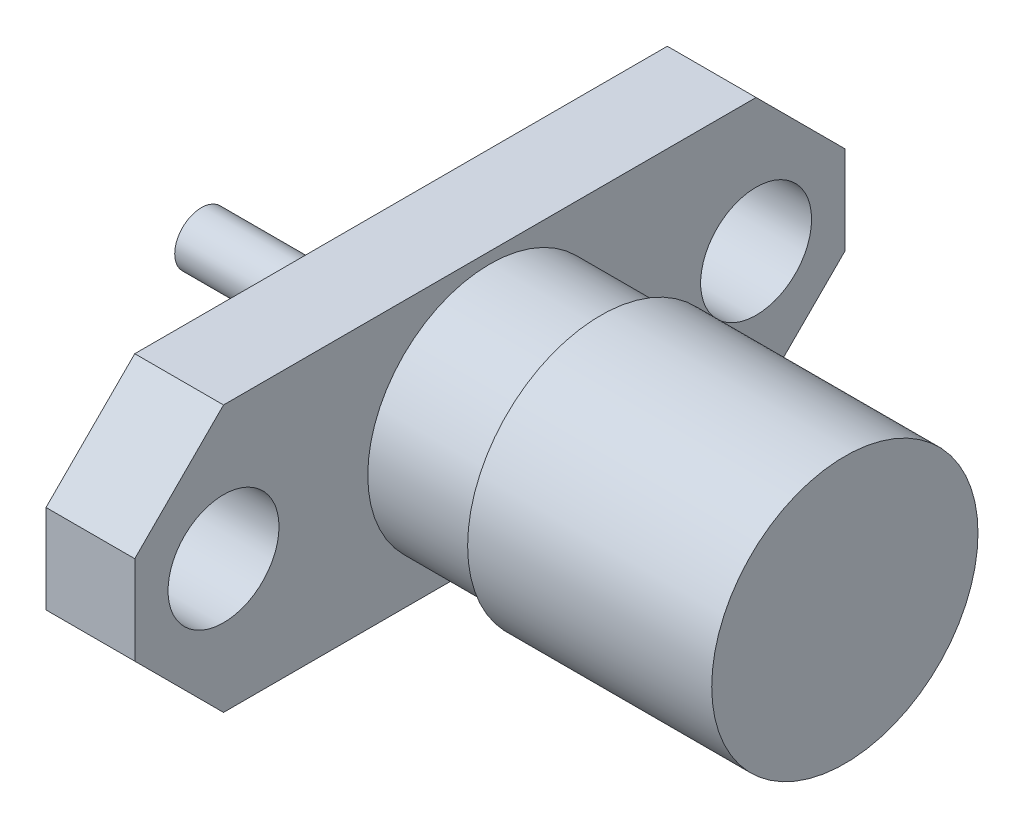
ISO-10303-21;
HEADER;
FILE_DESCRIPTION(('STEP AP214'),'2;1');
FILE_NAME('part.step','',(''),(''),'','','');
FILE_SCHEMA(('AUTOMOTIVE_DESIGN { 1 0 10303 214 1 1 1 1 }'));
ENDSEC;
DATA;
#1=APPLICATION_CONTEXT('core data for automotive mechanical design processes');
#2=APPLICATION_PROTOCOL_DEFINITION('international standard','automotive_design',2000,#1);
#3=PRODUCT_CONTEXT('',#1,'mechanical');
#4=PRODUCT('Part','Part','',(#3));
#5=PRODUCT_RELATED_PRODUCT_CATEGORY('part','',(#4));
#6=PRODUCT_DEFINITION_FORMATION('','',#4);
#7=PRODUCT_DEFINITION_CONTEXT('part definition',#1,'design');
#8=PRODUCT_DEFINITION('design','',#6,#7);
#9=PRODUCT_DEFINITION_SHAPE('','',#8);
#10=(LENGTH_UNIT() NAMED_UNIT(*) SI_UNIT(.MILLI.,.METRE.));
#11=(NAMED_UNIT(*) PLANE_ANGLE_UNIT() SI_UNIT($,.RADIAN.));
#12=(NAMED_UNIT(*) SI_UNIT($,.STERADIAN.) SOLID_ANGLE_UNIT());
#13=UNCERTAINTY_MEASURE_WITH_UNIT(LENGTH_MEASURE(1.E-05),#10,'distance_accuracy_value','');
#14=(GEOMETRIC_REPRESENTATION_CONTEXT(3) GLOBAL_UNCERTAINTY_ASSIGNED_CONTEXT((#13)) GLOBAL_UNIT_ASSIGNED_CONTEXT((#10,
#11,#12)) REPRESENTATION_CONTEXT('',''));
#15=CARTESIAN_POINT('',(0.,0.,0.));
#16=DIRECTION('',(0.,0.,1.));
#17=DIRECTION('',(1.,0.,0.));
#18=AXIS2_PLACEMENT_3D('',#15,#16,#17);
#19=CARTESIAN_POINT('',(2.,0.,8.));
#20=DIRECTION('',(0.,0.,1.));
#21=DIRECTION('',(1.,0.,0.));
#22=AXIS2_PLACEMENT_3D('',#19,#20,#21);
#23=PLANE('',#22);
#24=DIRECTION('',(0.,1.,0.));
#25=VECTOR('',#24,1.);
#26=CARTESIAN_POINT('',(0.,0.,8.));
#27=LINE('',#26,#25);
#28=CARTESIAN_POINT('',(0.,-0.999999999999881,8.));
#29=VERTEX_POINT('',#28);
#30=CARTESIAN_POINT('',(0.,0.999999999999882,8.));
#31=VERTEX_POINT('',#30);
#32=EDGE_CURVE('E155',#29,#31,#27,.T.);
#33=ORIENTED_EDGE('',*,*,#32,.F.);
#34=DIRECTION('',(-1.,0.,0.));
#35=VECTOR('',#34,1.);
#36=CARTESIAN_POINT('',(2.,-0.999999999999881,8.));
#37=LINE('',#36,#35);
#38=CARTESIAN_POINT('',(2.,-0.999999999999881,8.));
#39=VERTEX_POINT('',#38);
#40=EDGE_CURVE('E11',#39,#29,#37,.T.);
#41=ORIENTED_EDGE('',*,*,#40,.F.);
#42=DIRECTION('',(0.,1.,0.));
#43=VECTOR('',#42,1.);
#44=CARTESIAN_POINT('',(2.,0.,8.));
#45=LINE('',#44,#43);
#46=CARTESIAN_POINT('',(2.,0.999999999999882,8.));
#47=VERTEX_POINT('',#46);
#48=EDGE_CURVE('E171',#39,#47,#45,.T.);
#49=ORIENTED_EDGE('',*,*,#48,.T.);
#50=DIRECTION('',(-1.,0.,0.));
#51=VECTOR('',#50,1.);
#52=CARTESIAN_POINT('',(2.,0.999999999999882,8.));
#53=LINE('',#52,#51);
#54=EDGE_CURVE('E49',#47,#31,#53,.T.);
#55=ORIENTED_EDGE('',*,*,#54,.T.);
#56=EDGE_LOOP('',(#33,#41,#49,#55));
#57=FACE_BOUND('',#56,.T.);
#58=ADVANCED_FACE('F33',(#57),#23,.T.);
#59=CARTESIAN_POINT('',(2.,-4.49999999999991,4.50000000000018));
#60=DIRECTION('',(0.,0.707106781186526,-0.707106781186569));
#61=DIRECTION('',(0.,0.707106781186569,0.707106781186526));
#62=AXIS2_PLACEMENT_3D('',#59,#60,#61);
#63=PLANE('',#62);
#64=DIRECTION('',(0.,-0.707106781186569,-0.707106781186526));
#65=VECTOR('',#64,1.);
#66=CARTESIAN_POINT('',(0.,-4.49999999999991,4.50000000000018));
#67=LINE('',#66,#65);
#68=CARTESIAN_POINT('',(0.,-3.,6.));
#69=VERTEX_POINT('',#68);
#70=EDGE_CURVE('E148',#29,#69,#67,.T.);
#71=ORIENTED_EDGE('',*,*,#70,.T.);
#72=DIRECTION('',(-1.,0.,0.));
#73=VECTOR('',#72,1.);
#74=CARTESIAN_POINT('',(2.,-3.,6.));
#75=LINE('',#74,#73);
#76=CARTESIAN_POINT('',(2.,-3.,6.));
#77=VERTEX_POINT('',#76);
#78=EDGE_CURVE('E41',#77,#69,#75,.T.);
#79=ORIENTED_EDGE('',*,*,#78,.F.);
#80=DIRECTION('',(0.,-0.707106781186569,-0.707106781186526));
#81=VECTOR('',#80,1.);
#82=CARTESIAN_POINT('',(2.,-4.49999999999991,4.50000000000018));
#83=LINE('',#82,#81);
#84=EDGE_CURVE('E194',#39,#77,#83,.T.);
#85=ORIENTED_EDGE('',*,*,#84,.F.);
#86=ORIENTED_EDGE('',*,*,#40,.T.);
#87=EDGE_LOOP('',(#71,#79,#85,#86));
#88=FACE_BOUND('',#87,.T.);
#89=ADVANCED_FACE('F203',(#88),#63,.F.);
#90=CARTESIAN_POINT('',(2.,-3.,0.));
#91=DIRECTION('',(0.,1.,0.));
#92=DIRECTION('',(0.,0.,1.));
#93=AXIS2_PLACEMENT_3D('',#90,#91,#92);
#94=PLANE('',#93);
#95=DIRECTION('',(0.,0.,-1.));
#96=VECTOR('',#95,1.);
#97=CARTESIAN_POINT('',(0.,-3.,0.));
#98=LINE('',#97,#96);
#99=CARTESIAN_POINT('',(0.,-3.,-6.00000000000004));
#100=VERTEX_POINT('',#99);
#101=EDGE_CURVE('E140',#69,#100,#98,.T.);
#102=ORIENTED_EDGE('',*,*,#101,.T.);
#103=DIRECTION('',(-1.,0.,0.));
#104=VECTOR('',#103,1.);
#105=CARTESIAN_POINT('',(2.,-3.,-6.00000000000004));
#106=LINE('',#105,#104);
#107=CARTESIAN_POINT('',(2.,-3.,-6.00000000000004));
#108=VERTEX_POINT('',#107);
#109=EDGE_CURVE('E131',#108,#100,#106,.T.);
#110=ORIENTED_EDGE('',*,*,#109,.F.);
#111=DIRECTION('',(0.,0.,-1.));
#112=VECTOR('',#111,1.);
#113=CARTESIAN_POINT('',(2.,-3.,0.));
#114=LINE('',#113,#112);
#115=EDGE_CURVE('E142',#77,#108,#114,.T.);
#116=ORIENTED_EDGE('',*,*,#115,.F.);
#117=ORIENTED_EDGE('',*,*,#78,.T.);
#118=EDGE_LOOP('',(#102,#110,#116,#117));
#119=FACE_BOUND('',#118,.T.);
#120=ADVANCED_FACE('F138',(#119),#94,.F.);
#121=CARTESIAN_POINT('',(2.,-4.49999999999994,-4.50000000000018));
#122=DIRECTION('',(0.,-0.707106781186529,-0.707106781186567));
#123=DIRECTION('',(0.,0.707106781186567,-0.707106781186529));
#124=AXIS2_PLACEMENT_3D('',#121,#122,#123);
#125=PLANE('',#124);
#126=DIRECTION('',(0.,-0.707106781186567,0.707106781186528));
#127=VECTOR('',#126,1.);
#128=CARTESIAN_POINT('',(0.,-4.49999999999994,-4.50000000000018));
#129=LINE('',#128,#127);
#130=CARTESIAN_POINT('',(0.,-0.999999999999931,-8.));
#131=VERTEX_POINT('',#130);
#132=EDGE_CURVE('E151',#131,#100,#129,.T.);
#133=ORIENTED_EDGE('',*,*,#132,.F.);
#134=DIRECTION('',(-1.,0.,0.));
#135=VECTOR('',#134,1.);
#136=CARTESIAN_POINT('',(2.,-0.999999999999931,-8.));
#137=LINE('',#136,#135);
#138=CARTESIAN_POINT('',(2.,-0.999999999999931,-8.));
#139=VERTEX_POINT('',#138);
#140=EDGE_CURVE('E125',#139,#131,#137,.T.);
#141=ORIENTED_EDGE('',*,*,#140,.F.);
#142=DIRECTION('',(0.,-0.707106781186567,0.707106781186528));
#143=VECTOR('',#142,1.);
#144=CARTESIAN_POINT('',(2.,-4.49999999999994,-4.50000000000018));
#145=LINE('',#144,#143);
#146=EDGE_CURVE('E197',#139,#108,#145,.T.);
#147=ORIENTED_EDGE('',*,*,#146,.T.);
#148=ORIENTED_EDGE('',*,*,#109,.T.);
#149=EDGE_LOOP('',(#133,#141,#147,#148));
#150=FACE_BOUND('',#149,.T.);
#151=ADVANCED_FACE('F210',(#150),#125,.T.);
#152=CARTESIAN_POINT('',(2.,0.,-8.));
#153=DIRECTION('',(0.,0.,1.));
#154=DIRECTION('',(1.,0.,0.));
#155=AXIS2_PLACEMENT_3D('',#152,#153,#154);
#156=PLANE('',#155);
#157=DIRECTION('',(0.,1.,0.));
#158=VECTOR('',#157,1.);
#159=CARTESIAN_POINT('',(0.,0.,-8.));
#160=LINE('',#159,#158);
#161=CARTESIAN_POINT('',(0.,0.999999999999931,-8.));
#162=VERTEX_POINT('',#161);
#163=EDGE_CURVE('E153',#131,#162,#160,.T.);
#164=ORIENTED_EDGE('',*,*,#163,.T.);
#165=DIRECTION('',(-1.,0.,0.));
#166=VECTOR('',#165,1.);
#167=CARTESIAN_POINT('',(2.,0.999999999999931,-8.));
#168=LINE('',#167,#166);
#169=CARTESIAN_POINT('',(2.,0.999999999999931,-8.));
#170=VERTEX_POINT('',#169);
#171=EDGE_CURVE('E123',#170,#162,#168,.T.);
#172=ORIENTED_EDGE('',*,*,#171,.F.);
#173=DIRECTION('',(0.,1.,0.));
#174=VECTOR('',#173,1.);
#175=CARTESIAN_POINT('',(2.,0.,-8.));
#176=LINE('',#175,#174);
#177=EDGE_CURVE('E114',#139,#170,#176,.T.);
#178=ORIENTED_EDGE('',*,*,#177,.F.);
#179=ORIENTED_EDGE('',*,*,#140,.T.);
#180=EDGE_LOOP('',(#164,#172,#178,#179));
#181=FACE_BOUND('',#180,.T.);
#182=ADVANCED_FACE('F215',(#181),#156,.F.);
#183=CARTESIAN_POINT('',(2.,4.49999999999994,-4.50000000000018));
#184=DIRECTION('',(0.,-0.707106781186529,0.707106781186567));
#185=DIRECTION('',(0.,-0.707106781186567,-0.707106781186529));
#186=AXIS2_PLACEMENT_3D('',#183,#184,#185);
#187=PLANE('',#186);
#188=DIRECTION('',(0.,0.707106781186567,0.707106781186528));
#189=VECTOR('',#188,1.);
#190=CARTESIAN_POINT('',(0.,4.49999999999994,-4.50000000000018));
#191=LINE('',#190,#189);
#192=CARTESIAN_POINT('',(0.,3.,-6.00000000000004));
#193=VERTEX_POINT('',#192);
#194=EDGE_CURVE('E121',#162,#193,#191,.T.);
#195=ORIENTED_EDGE('',*,*,#194,.T.);
#196=DIRECTION('',(-1.,0.,0.));
#197=VECTOR('',#196,1.);
#198=CARTESIAN_POINT('',(2.,3.,-6.00000000000004));
#199=LINE('',#198,#197);
#200=CARTESIAN_POINT('',(2.,3.,-6.00000000000004));
#201=VERTEX_POINT('',#200);
#202=EDGE_CURVE('E102',#201,#193,#199,.T.);
#203=ORIENTED_EDGE('',*,*,#202,.F.);
#204=DIRECTION('',(0.,0.707106781186567,0.707106781186528));
#205=VECTOR('',#204,1.);
#206=CARTESIAN_POINT('',(2.,4.49999999999994,-4.50000000000018));
#207=LINE('',#206,#205);
#208=EDGE_CURVE('E107',#170,#201,#207,.T.);
#209=ORIENTED_EDGE('',*,*,#208,.F.);
#210=ORIENTED_EDGE('',*,*,#171,.T.);
#211=EDGE_LOOP('',(#195,#203,#209,#210));
#212=FACE_BOUND('',#211,.T.);
#213=ADVANCED_FACE('F119',(#212),#187,.F.);
#214=CARTESIAN_POINT('',(2.,3.,0.));
#215=DIRECTION('',(0.,1.,0.));
#216=DIRECTION('',(0.,0.,1.));
#217=AXIS2_PLACEMENT_3D('',#214,#215,#216);
#218=PLANE('',#217);
#219=DIRECTION('',(0.,0.,-1.));
#220=VECTOR('',#219,1.);
#221=CARTESIAN_POINT('',(0.,3.,0.));
#222=LINE('',#221,#220);
#223=CARTESIAN_POINT('',(0.,3.,6.));
#224=VERTEX_POINT('',#223);
#225=EDGE_CURVE('E161',#224,#193,#222,.T.);
#226=ORIENTED_EDGE('',*,*,#225,.F.);
#227=DIRECTION('',(-1.,0.,0.));
#228=VECTOR('',#227,1.);
#229=CARTESIAN_POINT('',(2.,3.,6.));
#230=LINE('',#229,#228);
#231=CARTESIAN_POINT('',(2.,3.,6.));
#232=VERTEX_POINT('',#231);
#233=EDGE_CURVE('E74',#232,#224,#230,.T.);
#234=ORIENTED_EDGE('',*,*,#233,.F.);
#235=DIRECTION('',(0.,0.,-1.));
#236=VECTOR('',#235,1.);
#237=CARTESIAN_POINT('',(2.,3.,0.));
#238=LINE('',#237,#236);
#239=EDGE_CURVE('E98',#232,#201,#238,.T.);
#240=ORIENTED_EDGE('',*,*,#239,.T.);
#241=ORIENTED_EDGE('',*,*,#202,.T.);
#242=EDGE_LOOP('',(#226,#234,#240,#241));
#243=FACE_BOUND('',#242,.T.);
#244=ADVANCED_FACE('F100',(#243),#218,.T.);
#245=CARTESIAN_POINT('',(2.,0.,6.00000000000001));
#246=DIRECTION('',(-1.,0.,0.));
#247=DIRECTION('',(0.,0.,1.));
#248=AXIS2_PLACEMENT_3D('',#245,#246,#247);
#249=CYLINDRICAL_SURFACE('',#248,1.25);
#250=CARTESIAN_POINT('',(2.,0.,6.00000000000001));
#251=DIRECTION('',(1.,0.,0.));
#252=DIRECTION('',(0.,0.,-1.));
#253=AXIS2_PLACEMENT_3D('',#250,#251,#252);
#254=CIRCLE('',#253,1.25);
#255=CARTESIAN_POINT('',(2.,0.,4.75000000000001));
#256=VERTEX_POINT('',#255);
#257=EDGE_CURVE('E174',#256,#256,#254,.T.);
#258=ORIENTED_EDGE('',*,*,#257,.T.);
#259=EDGE_LOOP('',(#258));
#260=FACE_BOUND('',#259,.T.);
#261=CARTESIAN_POINT('',(0.,0.,6.00000000000001));
#262=DIRECTION('',(1.,0.,0.));
#263=DIRECTION('',(0.,0.,-1.));
#264=AXIS2_PLACEMENT_3D('',#261,#262,#263);
#265=CIRCLE('',#264,1.25);
#266=CARTESIAN_POINT('',(0.,0.,4.75000000000001));
#267=VERTEX_POINT('',#266);
#268=EDGE_CURVE('E166',#267,#267,#265,.T.);
#269=ORIENTED_EDGE('',*,*,#268,.F.);
#270=EDGE_LOOP('',(#269));
#271=FACE_BOUND('',#270,.T.);
#272=ADVANCED_FACE('F224',(#260,#271),#249,.F.);
#273=CARTESIAN_POINT('',(2.,4.49999999999991,4.50000000000018));
#274=DIRECTION('',(0.,0.707106781186526,0.707106781186569));
#275=DIRECTION('',(0.,-0.707106781186569,0.707106781186526));
#276=AXIS2_PLACEMENT_3D('',#273,#274,#275);
#277=PLANE('',#276);
#278=DIRECTION('',(0.,0.707106781186569,-0.707106781186526));
#279=VECTOR('',#278,1.);
#280=CARTESIAN_POINT('',(0.,4.49999999999991,4.50000000000018));
#281=LINE('',#280,#279);
#282=EDGE_CURVE('E163',#31,#224,#281,.T.);
#283=ORIENTED_EDGE('',*,*,#282,.F.);
#284=ORIENTED_EDGE('',*,*,#54,.F.);
#285=DIRECTION('',(0.,0.707106781186569,-0.707106781186526));
#286=VECTOR('',#285,1.);
#287=CARTESIAN_POINT('',(2.,4.49999999999991,4.50000000000018));
#288=LINE('',#287,#286);
#289=EDGE_CURVE('E106',#47,#232,#288,.T.);
#290=ORIENTED_EDGE('',*,*,#289,.T.);
#291=ORIENTED_EDGE('',*,*,#233,.T.);
#292=EDGE_LOOP('',(#283,#284,#290,#291));
#293=FACE_BOUND('',#292,.T.);
#294=ADVANCED_FACE('F200',(#293),#277,.T.);
#295=CARTESIAN_POINT('',(2.,0.,-6.00000000000001));
#296=DIRECTION('',(-1.,0.,0.));
#297=DIRECTION('',(0.,0.,1.));
#298=AXIS2_PLACEMENT_3D('',#295,#296,#297);
#299=CYLINDRICAL_SURFACE('',#298,1.25);
#300=CARTESIAN_POINT('',(2.,0.,-6.00000000000001));
#301=DIRECTION('',(1.,0.,0.));
#302=DIRECTION('',(0.,0.,-1.));
#303=AXIS2_PLACEMENT_3D('',#300,#301,#302);
#304=CIRCLE('',#303,1.25);
#305=CARTESIAN_POINT('',(2.,0.,-7.25000000000001));
#306=VERTEX_POINT('',#305);
#307=EDGE_CURVE('E172',#306,#306,#304,.F.);
#308=ORIENTED_EDGE('',*,*,#307,.F.);
#309=EDGE_LOOP('',(#308));
#310=FACE_BOUND('',#309,.T.);
#311=CARTESIAN_POINT('',(0.,0.,-6.00000000000001));
#312=DIRECTION('',(1.,0.,0.));
#313=DIRECTION('',(0.,0.,-1.));
#314=AXIS2_PLACEMENT_3D('',#311,#312,#313);
#315=CIRCLE('',#314,1.25);
#316=CARTESIAN_POINT('',(0.,0.,-7.25000000000001));
#317=VERTEX_POINT('',#316);
#318=EDGE_CURVE('E169',#317,#317,#315,.F.);
#319=ORIENTED_EDGE('',*,*,#318,.T.);
#320=EDGE_LOOP('',(#319));
#321=FACE_BOUND('',#320,.T.);
#322=ADVANCED_FACE('F227',(#310,#321),#299,.F.);
#323=CARTESIAN_POINT('',(2.,0.,0.));
#324=DIRECTION('',(1.,0.,0.));
#325=DIRECTION('',(0.,0.,-1.));
#326=AXIS2_PLACEMENT_3D('',#323,#324,#325);
#327=PLANE('',#326);
#328=ORIENTED_EDGE('',*,*,#208,.T.);
#329=ORIENTED_EDGE('',*,*,#239,.F.);
#330=ORIENTED_EDGE('',*,*,#289,.F.);
#331=ORIENTED_EDGE('',*,*,#48,.F.);
#332=ORIENTED_EDGE('',*,*,#84,.T.);
#333=ORIENTED_EDGE('',*,*,#115,.T.);
#334=ORIENTED_EDGE('',*,*,#146,.F.);
#335=ORIENTED_EDGE('',*,*,#177,.T.);
#336=EDGE_LOOP('',(#328,#329,#330,#331,#332,#333,#334,#335));
#337=FACE_BOUND('',#336,.T.);
#338=ORIENTED_EDGE('',*,*,#307,.T.);
#339=EDGE_LOOP('',(#338));
#340=FACE_BOUND('',#339,.T.);
#341=CARTESIAN_POINT('',(2.,0.,0.));
#342=DIRECTION('',(-1.,0.,0.));
#343=DIRECTION('',(0.,0.,1.));
#344=AXIS2_PLACEMENT_3D('',#341,#342,#343);
#345=CIRCLE('',#344,2.75);
#346=CARTESIAN_POINT('',(2.,0.,2.75));
#347=VERTEX_POINT('',#346);
#348=EDGE_CURVE('E278',#347,#347,#345,.T.);
#349=ORIENTED_EDGE('',*,*,#348,.T.);
#350=EDGE_LOOP('',(#349));
#351=FACE_BOUND('',#350,.T.);
#352=ORIENTED_EDGE('',*,*,#257,.F.);
#353=EDGE_LOOP('',(#352));
#354=FACE_BOUND('',#353,.T.);
#355=ADVANCED_FACE('F110',(#337,#340,#351,#354),#327,.T.);
#356=CARTESIAN_POINT('',(0.,0.,0.));
#357=DIRECTION('',(1.,0.,0.));
#358=DIRECTION('',(0.,0.,-1.));
#359=AXIS2_PLACEMENT_3D('',#356,#357,#358);
#360=PLANE('',#359);
#361=CARTESIAN_POINT('',(0.,0.,0.));
#362=DIRECTION('',(-1.,0.,0.));
#363=DIRECTION('',(0.,0.,1.));
#364=AXIS2_PLACEMENT_3D('',#361,#362,#363);
#365=CIRCLE('',#364,2.25);
#366=CARTESIAN_POINT('',(0.,0.,2.25));
#367=VERTEX_POINT('',#366);
#368=EDGE_CURVE('E182',#367,#367,#365,.T.);
#369=ORIENTED_EDGE('',*,*,#368,.F.);
#370=EDGE_LOOP('',(#369));
#371=FACE_BOUND('',#370,.T.);
#372=ORIENTED_EDGE('',*,*,#32,.T.);
#373=ORIENTED_EDGE('',*,*,#282,.T.);
#374=ORIENTED_EDGE('',*,*,#225,.T.);
#375=ORIENTED_EDGE('',*,*,#194,.F.);
#376=ORIENTED_EDGE('',*,*,#163,.F.);
#377=ORIENTED_EDGE('',*,*,#132,.T.);
#378=ORIENTED_EDGE('',*,*,#101,.F.);
#379=ORIENTED_EDGE('',*,*,#70,.F.);
#380=EDGE_LOOP('',(#372,#373,#374,#375,#376,#377,#378,#379));
#381=FACE_BOUND('',#380,.T.);
#382=ORIENTED_EDGE('',*,*,#268,.T.);
#383=EDGE_LOOP('',(#382));
#384=FACE_BOUND('',#383,.T.);
#385=ORIENTED_EDGE('',*,*,#318,.F.);
#386=EDGE_LOOP('',(#385));
#387=FACE_BOUND('',#386,.T.);
#388=ADVANCED_FACE('F146',(#371,#381,#384,#387),#360,.F.);
#389=CARTESIAN_POINT('',(0.1,0.,0.));
#390=DIRECTION('',(-1.,0.,0.));
#391=DIRECTION('',(0.,0.,1.));
#392=AXIS2_PLACEMENT_3D('',#389,#390,#391);
#393=CYLINDRICAL_SURFACE('',#392,2.25);
#394=CARTESIAN_POINT('',(0.1,0.,0.));
#395=DIRECTION('',(-1.,0.,0.));
#396=DIRECTION('',(0.,0.,1.));
#397=AXIS2_PLACEMENT_3D('',#394,#395,#396);
#398=CIRCLE('',#397,2.25);
#399=CARTESIAN_POINT('',(0.1,0.,2.25));
#400=VERTEX_POINT('',#399);
#401=EDGE_CURVE('E180',#400,#400,#398,.T.);
#402=ORIENTED_EDGE('',*,*,#401,.F.);
#403=EDGE_LOOP('',(#402));
#404=FACE_BOUND('',#403,.T.);
#405=ORIENTED_EDGE('',*,*,#368,.T.);
#406=EDGE_LOOP('',(#405));
#407=FACE_BOUND('',#406,.T.);
#408=ADVANCED_FACE('F236',(#404,#407),#393,.F.);
#409=CARTESIAN_POINT('',(0.1,0.,0.));
#410=DIRECTION('',(-1.,0.,0.));
#411=DIRECTION('',(0.,0.,1.));
#412=AXIS2_PLACEMENT_3D('',#409,#410,#411);
#413=PLANE('',#412);
#414=CARTESIAN_POINT('',(0.1,0.,0.));
#415=DIRECTION('',(-1.,0.,0.));
#416=DIRECTION('',(0.,0.,1.));
#417=AXIS2_PLACEMENT_3D('',#414,#415,#416);
#418=CIRCLE('',#417,0.6);
#419=CARTESIAN_POINT('',(0.1,0.,0.6));
#420=VERTEX_POINT('',#419);
#421=EDGE_CURVE('E190',#420,#420,#418,.T.);
#422=ORIENTED_EDGE('',*,*,#421,.F.);
#423=EDGE_LOOP('',(#422));
#424=FACE_BOUND('',#423,.T.);
#425=ORIENTED_EDGE('',*,*,#401,.T.);
#426=EDGE_LOOP('',(#425));
#427=FACE_BOUND('',#426,.T.);
#428=ADVANCED_FACE('F242',(#424,#427),#413,.T.);
#429=CARTESIAN_POINT('',(-4.5,0.,0.));
#430=DIRECTION('',(1.,0.,0.));
#431=DIRECTION('',(0.,0.,-1.));
#432=AXIS2_PLACEMENT_3D('',#429,#430,#431);
#433=CYLINDRICAL_SURFACE('',#432,0.6);
#434=CARTESIAN_POINT('',(-4.5,0.,0.));
#435=DIRECTION('',(-1.,0.,0.));
#436=DIRECTION('',(0.,0.,1.));
#437=AXIS2_PLACEMENT_3D('',#434,#435,#436);
#438=CIRCLE('',#437,0.6);
#439=CARTESIAN_POINT('',(-4.5,0.,0.6));
#440=VERTEX_POINT('',#439);
#441=EDGE_CURVE('E187',#440,#440,#438,.T.);
#442=ORIENTED_EDGE('',*,*,#441,.F.);
#443=EDGE_LOOP('',(#442));
#444=FACE_BOUND('',#443,.T.);
#445=ORIENTED_EDGE('',*,*,#421,.T.);
#446=EDGE_LOOP('',(#445));
#447=FACE_BOUND('',#446,.T.);
#448=ADVANCED_FACE('F246',(#444,#447),#433,.T.);
#449=CARTESIAN_POINT('',(-4.5,0.,0.));
#450=DIRECTION('',(-1.,0.,0.));
#451=DIRECTION('',(0.,0.,1.));
#452=AXIS2_PLACEMENT_3D('',#449,#450,#451);
#453=PLANE('',#452);
#454=ORIENTED_EDGE('',*,*,#441,.T.);
#455=EDGE_LOOP('',(#454));
#456=FACE_BOUND('',#455,.T.);
#457=ADVANCED_FACE('F250',(#456),#453,.T.);
#458=CARTESIAN_POINT('',(4.5,0.,0.));
#459=DIRECTION('',(1.,0.,0.));
#460=DIRECTION('',(0.,0.,-1.));
#461=AXIS2_PLACEMENT_3D('',#458,#459,#460);
#462=PLANE('',#461);
#463=CARTESIAN_POINT('',(4.49999999999995,0.,0.));
#464=DIRECTION('',(-1.,0.,0.));
#465=DIRECTION('',(0.,0.,1.));
#466=AXIS2_PLACEMENT_3D('',#463,#464,#465);
#467=CIRCLE('',#466,2.75);
#468=CARTESIAN_POINT('',(4.49999999999995,0.,2.75));
#469=VERTEX_POINT('',#468);
#470=EDGE_CURVE('E275',#469,#469,#467,.T.);
#471=ORIENTED_EDGE('',*,*,#470,.F.);
#472=EDGE_LOOP('',(#471));
#473=FACE_BOUND('',#472,.T.);
#474=CARTESIAN_POINT('',(4.49999999999995,0.,0.));
#475=DIRECTION('',(-1.,0.,0.));
#476=DIRECTION('',(0.,0.,1.));
#477=AXIS2_PLACEMENT_3D('',#474,#475,#476);
#478=CIRCLE('',#477,3.);
#479=CARTESIAN_POINT('',(4.49999999999995,0.,3.));
#480=VERTEX_POINT('',#479);
#481=EDGE_CURVE('E280',#480,#480,#478,.T.);
#482=ORIENTED_EDGE('',*,*,#481,.T.);
#483=EDGE_LOOP('',(#482));
#484=FACE_BOUND('',#483,.T.);
#485=ADVANCED_FACE('F254',(#473,#484),#462,.F.);
#486=CARTESIAN_POINT('',(-1000.,0.,0.));
#487=DIRECTION('',(-1.,0.,0.));
#488=DIRECTION('',(0.,0.,1.));
#489=AXIS2_PLACEMENT_3D('',#486,#487,#488);
#490=CYLINDRICAL_SURFACE('',#489,2.75);
#491=ORIENTED_EDGE('',*,*,#470,.T.);
#492=EDGE_LOOP('',(#491));
#493=FACE_BOUND('',#492,.T.);
#494=ORIENTED_EDGE('',*,*,#348,.F.);
#495=EDGE_LOOP('',(#494));
#496=FACE_BOUND('',#495,.T.);
#497=ADVANCED_FACE('F263',(#493,#496),#490,.T.);
#498=CARTESIAN_POINT('',(10.,0.,0.));
#499=DIRECTION('',(1.,0.,0.));
#500=DIRECTION('',(0.,0.,-1.));
#501=AXIS2_PLACEMENT_3D('',#498,#499,#500);
#502=PLANE('',#501);
#503=CARTESIAN_POINT('',(10.,0.,0.));
#504=DIRECTION('',(1.,0.,0.));
#505=DIRECTION('',(0.,0.,-1.));
#506=AXIS2_PLACEMENT_3D('',#503,#504,#505);
#507=CIRCLE('',#506,3.);
#508=CARTESIAN_POINT('',(10.,0.,-3.));
#509=VERTEX_POINT('',#508);
#510=EDGE_CURVE('E283',#509,#509,#507,.T.);
#511=ORIENTED_EDGE('',*,*,#510,.T.);
#512=EDGE_LOOP('',(#511));
#513=FACE_BOUND('',#512,.T.);
#514=ADVANCED_FACE('F259',(#513),#502,.T.);
#515=CARTESIAN_POINT('',(10.,0.,0.));
#516=DIRECTION('',(-1.,0.,0.));
#517=DIRECTION('',(0.,0.,1.));
#518=AXIS2_PLACEMENT_3D('',#515,#516,#517);
#519=CYLINDRICAL_SURFACE('',#518,3.);
#520=ORIENTED_EDGE('',*,*,#481,.F.);
#521=EDGE_LOOP('',(#520));
#522=FACE_BOUND('',#521,.T.);
#523=ORIENTED_EDGE('',*,*,#510,.F.);
#524=EDGE_LOOP('',(#523));
#525=FACE_BOUND('',#524,.T.);
#526=ADVANCED_FACE('F256',(#522,#525),#519,.T.);
#527=CLOSED_SHELL('',(#58,#89,#120,#151,#182,#213,#244,#272,#294,#322,#355,#388,#408,#428,#448,
#457,#485,#497,#514,#526));
#528=MANIFOLD_SOLID_BREP('B2',#527);
#529=ADVANCED_BREP_SHAPE_REPRESENTATION('',(#18,#528),#14);
#530=SHAPE_DEFINITION_REPRESENTATION(#9,#529);
ENDSEC;
END-ISO-10303-21;
